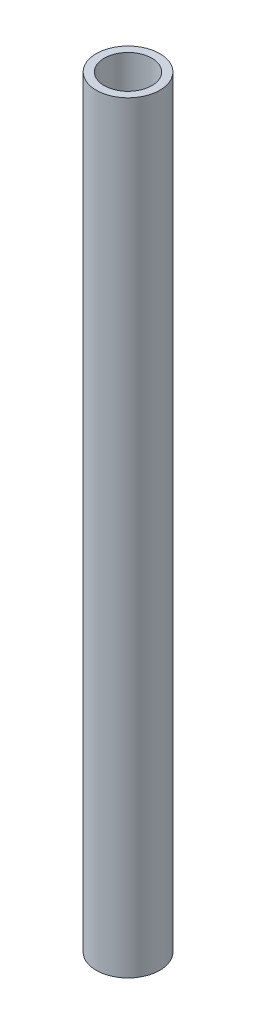
ISO-10303-21;
HEADER;
FILE_DESCRIPTION(('STEP AP214'),'2;1');
FILE_NAME('part.step','',(''),(''),'','','');
FILE_SCHEMA(('AUTOMOTIVE_DESIGN { 1 0 10303 214 1 1 1 1 }'));
ENDSEC;
DATA;
#1=APPLICATION_CONTEXT('core data for automotive mechanical design processes');
#2=APPLICATION_PROTOCOL_DEFINITION('international standard','automotive_design',2000,#1);
#3=PRODUCT_CONTEXT('',#1,'mechanical');
#4=PRODUCT('Part','Part','',(#3));
#5=PRODUCT_RELATED_PRODUCT_CATEGORY('part','',(#4));
#6=PRODUCT_DEFINITION_FORMATION('','',#4);
#7=PRODUCT_DEFINITION_CONTEXT('part definition',#1,'design');
#8=PRODUCT_DEFINITION('design','',#6,#7);
#9=PRODUCT_DEFINITION_SHAPE('','',#8);
#10=(LENGTH_UNIT() NAMED_UNIT(*) SI_UNIT(.MILLI.,.METRE.));
#11=(NAMED_UNIT(*) PLANE_ANGLE_UNIT() SI_UNIT($,.RADIAN.));
#12=(NAMED_UNIT(*) SI_UNIT($,.STERADIAN.) SOLID_ANGLE_UNIT());
#13=UNCERTAINTY_MEASURE_WITH_UNIT(LENGTH_MEASURE(1.E-05),#10,'distance_accuracy_value','');
#14=(GEOMETRIC_REPRESENTATION_CONTEXT(3) GLOBAL_UNCERTAINTY_ASSIGNED_CONTEXT((#13)) GLOBAL_UNIT_ASSIGNED_CONTEXT((#10,
#11,#12)) REPRESENTATION_CONTEXT('',''));
#15=CARTESIAN_POINT('',(0.,0.,0.));
#16=DIRECTION('',(0.,0.,1.));
#17=DIRECTION('',(1.,0.,0.));
#18=AXIS2_PLACEMENT_3D('',#15,#16,#17);
#19=CARTESIAN_POINT('',(0.,609.6,0.));
#20=DIRECTION('',(0.,1.,0.));
#21=DIRECTION('',(0.,0.,1.));
#22=AXIS2_PLACEMENT_3D('',#19,#20,#21);
#23=PLANE('',#22);
#24=CARTESIAN_POINT('',(0.,609.6,0.));
#25=DIRECTION('',(0.,1.,0.));
#26=DIRECTION('',(0.,0.,1.));
#27=AXIS2_PLACEMENT_3D('',#24,#25,#26);
#28=CIRCLE('',#27,25.4);
#29=CARTESIAN_POINT('',(0.,609.6,-25.4));
#30=VERTEX_POINT('',#29);
#31=EDGE_CURVE('E10',#30,#30,#28,.T.);
#32=ORIENTED_EDGE('',*,*,#31,.T.);
#33=EDGE_LOOP('',(#32));
#34=FACE_BOUND('',#33,.T.);
#35=CARTESIAN_POINT('',(0.,609.6,0.));
#36=DIRECTION('',(0.,1.,0.));
#37=DIRECTION('',(0.,0.,1.));
#38=AXIS2_PLACEMENT_3D('',#35,#36,#37);
#39=CIRCLE('',#38,19.05);
#40=CARTESIAN_POINT('',(0.,609.6,-19.05));
#41=VERTEX_POINT('',#40);
#42=EDGE_CURVE('E43',#41,#41,#39,.T.);
#43=ORIENTED_EDGE('',*,*,#42,.F.);
#44=EDGE_LOOP('',(#43));
#45=FACE_BOUND('',#44,.T.);
#46=ADVANCED_FACE('F32',(#34,#45),#23,.T.);
#47=CARTESIAN_POINT('',(0.,0.,0.));
#48=DIRECTION('',(0.,1.,0.));
#49=DIRECTION('',(0.,0.,1.));
#50=AXIS2_PLACEMENT_3D('',#47,#48,#49);
#51=PLANE('',#50);
#52=CARTESIAN_POINT('',(0.,0.,0.));
#53=DIRECTION('',(0.,1.,0.));
#54=DIRECTION('',(0.,0.,1.));
#55=AXIS2_PLACEMENT_3D('',#52,#53,#54);
#56=CIRCLE('',#55,25.4);
#57=CARTESIAN_POINT('',(0.,0.,-25.4));
#58=VERTEX_POINT('',#57);
#59=EDGE_CURVE('E36',#58,#58,#56,.T.);
#60=ORIENTED_EDGE('',*,*,#59,.F.);
#61=EDGE_LOOP('',(#60));
#62=FACE_BOUND('',#61,.T.);
#63=CARTESIAN_POINT('',(0.,0.,0.));
#64=DIRECTION('',(0.,1.,0.));
#65=DIRECTION('',(0.,0.,1.));
#66=AXIS2_PLACEMENT_3D('',#63,#64,#65);
#67=CIRCLE('',#66,19.05);
#68=CARTESIAN_POINT('',(0.,0.,-19.05));
#69=VERTEX_POINT('',#68);
#70=EDGE_CURVE('E45',#69,#69,#67,.T.);
#71=ORIENTED_EDGE('',*,*,#70,.T.);
#72=EDGE_LOOP('',(#71));
#73=FACE_BOUND('',#72,.T.);
#74=ADVANCED_FACE('F55',(#62,#73),#51,.F.);
#75=CARTESIAN_POINT('',(0.,609.6,0.));
#76=DIRECTION('',(0.,-1.,0.));
#77=DIRECTION('',(0.,0.,-1.));
#78=AXIS2_PLACEMENT_3D('',#75,#76,#77);
#79=CYLINDRICAL_SURFACE('',#78,25.4);
#80=CARTESIAN_POINT('',(0.,609.6,-25.4));
#81=CARTESIAN_POINT('',(0.,603.25,-25.4));
#82=CARTESIAN_POINT('',(0.,596.9,-25.4));
#83=CARTESIAN_POINT('',(0.,584.2,-25.4));
#84=CARTESIAN_POINT('',(0.,577.85,-25.4));
#85=CARTESIAN_POINT('',(0.,565.15,-25.4));
#86=CARTESIAN_POINT('',(0.,558.8,-25.4));
#87=CARTESIAN_POINT('',(0.,546.1,-25.4));
#88=CARTESIAN_POINT('',(0.,539.75,-25.4));
#89=CARTESIAN_POINT('',(0.,527.05,-25.4));
#90=CARTESIAN_POINT('',(0.,520.7,-25.4));
#91=CARTESIAN_POINT('',(0.,508.,-25.4));
#92=CARTESIAN_POINT('',(0.,501.65,-25.4));
#93=CARTESIAN_POINT('',(0.,488.95,-25.4));
#94=CARTESIAN_POINT('',(0.,482.6,-25.4));
#95=CARTESIAN_POINT('',(0.,469.9,-25.4));
#96=CARTESIAN_POINT('',(0.,463.55,-25.4));
#97=CARTESIAN_POINT('',(0.,450.85,-25.4));
#98=CARTESIAN_POINT('',(0.,444.5,-25.4));
#99=CARTESIAN_POINT('',(0.,431.8,-25.4));
#100=CARTESIAN_POINT('',(0.,425.45,-25.4));
#101=CARTESIAN_POINT('',(0.,412.75,-25.4));
#102=CARTESIAN_POINT('',(0.,406.4,-25.4));
#103=CARTESIAN_POINT('',(0.,393.7,-25.4));
#104=CARTESIAN_POINT('',(0.,387.35,-25.4));
#105=CARTESIAN_POINT('',(0.,374.65,-25.4));
#106=CARTESIAN_POINT('',(0.,368.3,-25.4));
#107=CARTESIAN_POINT('',(0.,355.6,-25.4));
#108=CARTESIAN_POINT('',(0.,349.25,-25.4));
#109=CARTESIAN_POINT('',(0.,336.55,-25.4));
#110=CARTESIAN_POINT('',(0.,330.2,-25.4));
#111=CARTESIAN_POINT('',(0.,317.5,-25.4));
#112=CARTESIAN_POINT('',(0.,311.15,-25.4));
#113=CARTESIAN_POINT('',(0.,298.45,-25.4));
#114=CARTESIAN_POINT('',(0.,292.1,-25.4));
#115=CARTESIAN_POINT('',(0.,279.4,-25.4));
#116=CARTESIAN_POINT('',(0.,273.05,-25.4));
#117=CARTESIAN_POINT('',(0.,260.35,-25.4));
#118=CARTESIAN_POINT('',(0.,254.,-25.4));
#119=CARTESIAN_POINT('',(0.,241.3,-25.4));
#120=CARTESIAN_POINT('',(0.,234.95,-25.4));
#121=CARTESIAN_POINT('',(0.,222.25,-25.4));
#122=CARTESIAN_POINT('',(0.,215.9,-25.4));
#123=CARTESIAN_POINT('',(0.,203.2,-25.4));
#124=CARTESIAN_POINT('',(0.,196.85,-25.4));
#125=CARTESIAN_POINT('',(0.,184.15,-25.4));
#126=CARTESIAN_POINT('',(0.,177.8,-25.4));
#127=CARTESIAN_POINT('',(0.,165.1,-25.4));
#128=CARTESIAN_POINT('',(0.,158.75,-25.4));
#129=CARTESIAN_POINT('',(0.,146.05,-25.4));
#130=CARTESIAN_POINT('',(0.,139.7,-25.4));
#131=CARTESIAN_POINT('',(0.,127.,-25.4));
#132=CARTESIAN_POINT('',(0.,120.65,-25.4));
#133=CARTESIAN_POINT('',(0.,107.95,-25.4));
#134=CARTESIAN_POINT('',(0.,101.6,-25.4));
#135=CARTESIAN_POINT('',(0.,88.9,-25.4));
#136=CARTESIAN_POINT('',(0.,82.5500000000001,-25.4));
#137=CARTESIAN_POINT('',(0.,69.85,-25.4));
#138=CARTESIAN_POINT('',(0.,63.5,-25.4));
#139=CARTESIAN_POINT('',(0.,50.8,-25.4));
#140=CARTESIAN_POINT('',(0.,44.45,-25.4));
#141=CARTESIAN_POINT('',(0.,31.75,-25.4));
#142=CARTESIAN_POINT('',(0.,25.4,-25.4));
#143=CARTESIAN_POINT('',(0.,12.7,-25.4));
#144=CARTESIAN_POINT('',(0.,6.35000000000001,-25.4));
#145=CARTESIAN_POINT('',(0.,0.,-25.4));
#146=B_SPLINE_CURVE_WITH_KNOTS('',3,(#80,#81,#82,#83,#84,#85,#86,#87,#88,#89,#90,#91,#92,#93,
#94,#95,#96,#97,#98,#99,#100,#101,#102,#103,#104,#105,#106,#107,#108,#109,#110,#111,#112,#113,
#114,#115,#116,#117,#118,#119,#120,#121,#122,#123,#124,#125,#126,#127,#128,#129,#130,#131,#132,
#133,#134,#135,#136,#137,#138,#139,#140,#141,#142,#143,#144,#145),.UNSPECIFIED.,.F.,.F.,(4,2,2,
2,2,2,2,2,2,2,2,2,2,2,2,2,2,2,2,2,2,2,2,2,2,2,2,2,2,2,2,2,4),(0.,19.05,38.1,57.15,76.2,
95.2500000000001,114.3,133.35,152.4,171.45,190.5,209.55,228.6,247.65,266.7,285.75,304.8,323.85,
342.9,361.95,381.,400.05,419.1,438.15,457.2,476.25,495.3,514.35,533.4,552.45,571.5,590.55,
609.6),.UNSPECIFIED.);
#147=EDGE_CURVE('BSEAM34',#30,#58,#146,.T.);
#148=ORIENTED_EDGE('',*,*,#31,.F.);
#149=ORIENTED_EDGE('',*,*,#59,.T.);
#150=ORIENTED_EDGE('',*,*,#147,.T.);
#151=ORIENTED_EDGE('',*,*,#147,.F.);
#152=EDGE_LOOP('',(#148,#150,#149,#151));
#153=FACE_BOUND('',#152,.T.);
#154=ADVANCED_FACE('F34',(#153),#79,.T.);
#155=CARTESIAN_POINT('',(0.,609.6,0.));
#156=DIRECTION('',(0.,-1.,0.));
#157=DIRECTION('',(0.,0.,-1.));
#158=AXIS2_PLACEMENT_3D('',#155,#156,#157);
#159=CYLINDRICAL_SURFACE('',#158,19.05);
#160=CARTESIAN_POINT('',(0.,609.6,-19.05));
#161=CARTESIAN_POINT('',(0.,603.25,-19.05));
#162=CARTESIAN_POINT('',(0.,596.9,-19.05));
#163=CARTESIAN_POINT('',(0.,584.2,-19.05));
#164=CARTESIAN_POINT('',(0.,577.85,-19.05));
#165=CARTESIAN_POINT('',(0.,565.15,-19.05));
#166=CARTESIAN_POINT('',(0.,558.8,-19.05));
#167=CARTESIAN_POINT('',(0.,546.1,-19.05));
#168=CARTESIAN_POINT('',(0.,539.75,-19.05));
#169=CARTESIAN_POINT('',(0.,527.05,-19.05));
#170=CARTESIAN_POINT('',(0.,520.7,-19.05));
#171=CARTESIAN_POINT('',(0.,508.,-19.05));
#172=CARTESIAN_POINT('',(0.,501.65,-19.05));
#173=CARTESIAN_POINT('',(0.,488.95,-19.05));
#174=CARTESIAN_POINT('',(0.,482.6,-19.05));
#175=CARTESIAN_POINT('',(0.,469.9,-19.05));
#176=CARTESIAN_POINT('',(0.,463.55,-19.05));
#177=CARTESIAN_POINT('',(0.,450.85,-19.05));
#178=CARTESIAN_POINT('',(0.,444.5,-19.05));
#179=CARTESIAN_POINT('',(0.,431.8,-19.05));
#180=CARTESIAN_POINT('',(0.,425.45,-19.05));
#181=CARTESIAN_POINT('',(0.,412.75,-19.05));
#182=CARTESIAN_POINT('',(0.,406.4,-19.05));
#183=CARTESIAN_POINT('',(0.,393.7,-19.05));
#184=CARTESIAN_POINT('',(0.,387.35,-19.05));
#185=CARTESIAN_POINT('',(0.,374.65,-19.05));
#186=CARTESIAN_POINT('',(0.,368.3,-19.05));
#187=CARTESIAN_POINT('',(0.,355.6,-19.05));
#188=CARTESIAN_POINT('',(0.,349.25,-19.05));
#189=CARTESIAN_POINT('',(0.,336.55,-19.05));
#190=CARTESIAN_POINT('',(0.,330.2,-19.05));
#191=CARTESIAN_POINT('',(0.,317.5,-19.05));
#192=CARTESIAN_POINT('',(0.,311.15,-19.05));
#193=CARTESIAN_POINT('',(0.,298.45,-19.05));
#194=CARTESIAN_POINT('',(0.,292.1,-19.05));
#195=CARTESIAN_POINT('',(0.,279.4,-19.05));
#196=CARTESIAN_POINT('',(0.,273.05,-19.05));
#197=CARTESIAN_POINT('',(0.,260.35,-19.05));
#198=CARTESIAN_POINT('',(0.,254.,-19.05));
#199=CARTESIAN_POINT('',(0.,241.3,-19.05));
#200=CARTESIAN_POINT('',(0.,234.95,-19.05));
#201=CARTESIAN_POINT('',(0.,222.25,-19.05));
#202=CARTESIAN_POINT('',(0.,215.9,-19.05));
#203=CARTESIAN_POINT('',(0.,203.2,-19.05));
#204=CARTESIAN_POINT('',(0.,196.85,-19.05));
#205=CARTESIAN_POINT('',(0.,184.15,-19.05));
#206=CARTESIAN_POINT('',(0.,177.8,-19.05));
#207=CARTESIAN_POINT('',(0.,165.1,-19.05));
#208=CARTESIAN_POINT('',(0.,158.75,-19.05));
#209=CARTESIAN_POINT('',(0.,146.05,-19.05));
#210=CARTESIAN_POINT('',(0.,139.7,-19.05));
#211=CARTESIAN_POINT('',(0.,127.,-19.05));
#212=CARTESIAN_POINT('',(0.,120.65,-19.05));
#213=CARTESIAN_POINT('',(0.,107.95,-19.05));
#214=CARTESIAN_POINT('',(0.,101.6,-19.05));
#215=CARTESIAN_POINT('',(0.,88.9,-19.05));
#216=CARTESIAN_POINT('',(0.,82.5500000000001,-19.05));
#217=CARTESIAN_POINT('',(0.,69.85,-19.05));
#218=CARTESIAN_POINT('',(0.,63.5,-19.05));
#219=CARTESIAN_POINT('',(0.,50.8,-19.05));
#220=CARTESIAN_POINT('',(0.,44.45,-19.05));
#221=CARTESIAN_POINT('',(0.,31.75,-19.05));
#222=CARTESIAN_POINT('',(0.,25.4,-19.05));
#223=CARTESIAN_POINT('',(0.,12.7,-19.05));
#224=CARTESIAN_POINT('',(0.,6.35000000000001,-19.05));
#225=CARTESIAN_POINT('',(0.,0.,-19.05));
#226=B_SPLINE_CURVE_WITH_KNOTS('',3,(#160,#161,#162,#163,#164,#165,#166,#167,#168,#169,#170,
#171,#172,#173,#174,#175,#176,#177,#178,#179,#180,#181,#182,#183,#184,#185,#186,#187,#188,#189,
#190,#191,#192,#193,#194,#195,#196,#197,#198,#199,#200,#201,#202,#203,#204,#205,#206,#207,#208,
#209,#210,#211,#212,#213,#214,#215,#216,#217,#218,#219,#220,#221,#222,#223,#224,#225),
.UNSPECIFIED.,.F.,.F.,(4,2,2,2,2,2,2,2,2,2,2,2,2,2,2,2,2,2,2,2,2,2,2,2,2,2,2,2,2,2,2,2,4),(0.,
19.0499999999999,38.0999999999999,57.1499999999999,76.1999999999999,95.2499999999999,114.3,
133.35,152.4,171.45,190.5,209.55,228.6,247.65,266.7,285.75,304.8,323.85,342.9,361.95,381.,
400.05,419.1,438.15,457.2,476.25,495.3,514.35,533.4,552.45,571.5,590.55,609.6),.UNSPECIFIED.);
#227=EDGE_CURVE('BSEAM51',#41,#69,#226,.T.);
#228=ORIENTED_EDGE('',*,*,#42,.T.);
#229=ORIENTED_EDGE('',*,*,#70,.F.);
#230=ORIENTED_EDGE('',*,*,#227,.T.);
#231=ORIENTED_EDGE('',*,*,#227,.F.);
#232=EDGE_LOOP('',(#228,#230,#229,#231));
#233=FACE_BOUND('',#232,.T.);
#234=ADVANCED_FACE('F51',(#233),#159,.F.);
#235=CLOSED_SHELL('',(#46,#74,#154,#234));
#236=MANIFOLD_SOLID_BREP('B2',#235);
#237=ADVANCED_BREP_SHAPE_REPRESENTATION('',(#18,#236),#14);
#238=SHAPE_DEFINITION_REPRESENTATION(#9,#237);
ENDSEC;
END-ISO-10303-21;
